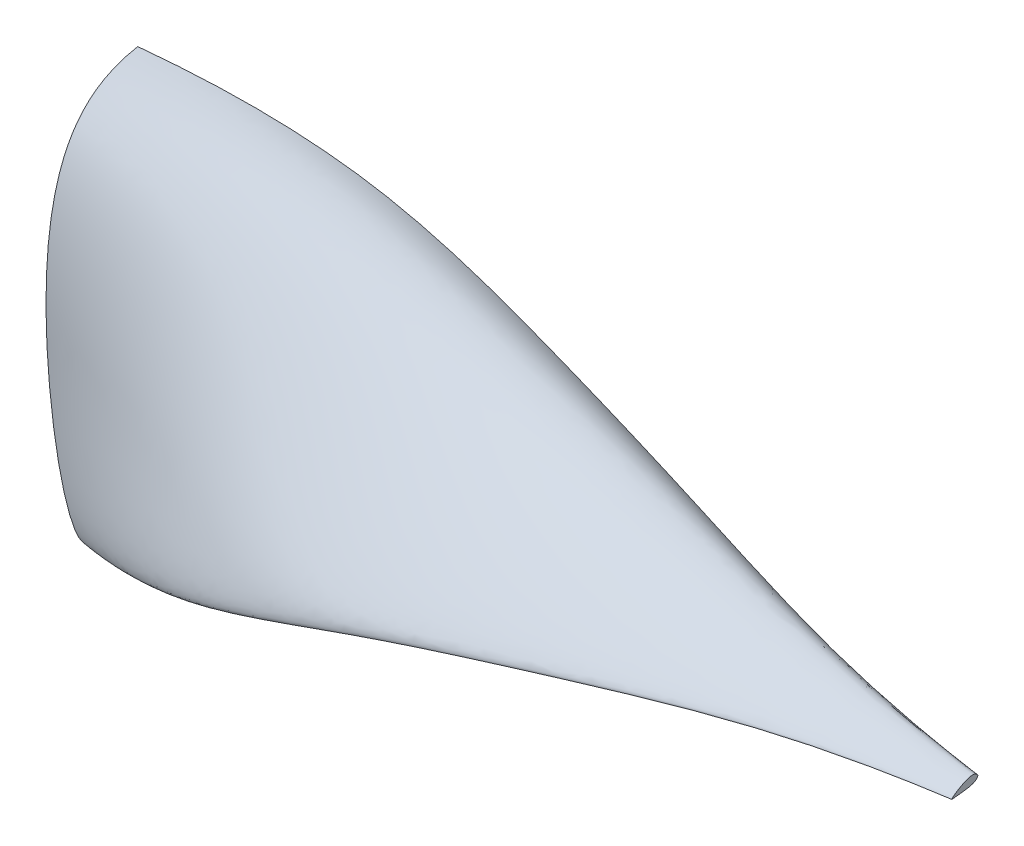
ISO-10303-21;
HEADER;
FILE_DESCRIPTION(('STEP AP214'),'2;1');
FILE_NAME('part.step','',(''),(''),'','','');
FILE_SCHEMA(('AUTOMOTIVE_DESIGN { 1 0 10303 214 1 1 1 1 }'));
ENDSEC;
DATA;
#1=APPLICATION_CONTEXT('core data for automotive mechanical design processes');
#2=APPLICATION_PROTOCOL_DEFINITION('international standard','automotive_design',2000,#1);
#3=PRODUCT_CONTEXT('',#1,'mechanical');
#4=PRODUCT('Part','Part','',(#3));
#5=PRODUCT_RELATED_PRODUCT_CATEGORY('part','',(#4));
#6=PRODUCT_DEFINITION_FORMATION('','',#4);
#7=PRODUCT_DEFINITION_CONTEXT('part definition',#1,'design');
#8=PRODUCT_DEFINITION('design','',#6,#7);
#9=PRODUCT_DEFINITION_SHAPE('','',#8);
#10=(LENGTH_UNIT() NAMED_UNIT(*) SI_UNIT(.MILLI.,.METRE.));
#11=(NAMED_UNIT(*) PLANE_ANGLE_UNIT() SI_UNIT($,.RADIAN.));
#12=(NAMED_UNIT(*) SI_UNIT($,.STERADIAN.) SOLID_ANGLE_UNIT());
#13=UNCERTAINTY_MEASURE_WITH_UNIT(LENGTH_MEASURE(1.E-05),#10,'distance_accuracy_value','');
#14=(GEOMETRIC_REPRESENTATION_CONTEXT(3) GLOBAL_UNCERTAINTY_ASSIGNED_CONTEXT((#13)) GLOBAL_UNIT_ASSIGNED_CONTEXT((#10,
#11,#12)) REPRESENTATION_CONTEXT('',''));
#15=CARTESIAN_POINT('',(0.,0.,0.));
#16=DIRECTION('',(0.,0.,1.));
#17=DIRECTION('',(1.,0.,0.));
#18=AXIS2_PLACEMENT_3D('',#15,#16,#17);
#19=CARTESIAN_POINT('',(250.,1.30686548325829,0.273489656084105));
#20=DIRECTION('',(-1.,0.,0.));
#21=DIRECTION('',(0.,0.,1.));
#22=AXIS2_PLACEMENT_3D('',#19,#20,#21);
#23=PLANE('',#22);
#24=CARTESIAN_POINT('',(250.,1.16948681889095,-3.82521902385213));
#25=CARTESIAN_POINT('',(250.,3.10858384582785,-2.51728156419939));
#26=CARTESIAN_POINT('',(250.,1.72673747669236,-0.151069954095973));
#27=CARTESIAN_POINT('',(250.,-0.471228127833241,3.83784511967977));
#28=CARTESIAN_POINT('',(250.,-1.16948681889095,3.82521902385213));
#29=B_SPLINE_CURVE_WITH_KNOTS('',4,(#24,#25,#26,#27,#28),.UNSPECIFIED.,.F.,.F.,(5,5),(0.,1.),.UNSPECIFIED.);
#30=CARTESIAN_POINT('',(250.,1.16948681889095,-3.82521902385213));
#31=VERTEX_POINT('',#30);
#32=CARTESIAN_POINT('',(250.,-1.16948681889095,3.82521902385213));
#33=VERTEX_POINT('',#32);
#34=EDGE_CURVE('E86',#31,#33,#29,.T.);
#35=ORIENTED_EDGE('',*,*,#34,.T.);
#36=CARTESIAN_POINT('',(250.,1.16948681889095,-3.82521902385213));
#37=CARTESIAN_POINT('',(250.,-0.296329525342011,-3.38706197351193));
#38=CARTESIAN_POINT('',(250.,-0.638437600874557,-1.75409289213371));
#39=CARTESIAN_POINT('',(250.,-1.16948681889095,3.82521902385213));
#40=B_SPLINE_CURVE_WITH_KNOTS('',3,(#36,#37,#38,#39),.UNSPECIFIED.,.F.,.F.,(4,4),(0.,1.),.UNSPECIFIED.);
#41=EDGE_CURVE('E12',#31,#33,#40,.T.);
#42=ORIENTED_EDGE('',*,*,#41,.F.);
#43=EDGE_LOOP('',(#35,#42));
#44=FACE_BOUND('',#43,.T.);
#45=ADVANCED_FACE('F76',(#44),#23,.F.);
#46=CARTESIAN_POINT('',(0.,4.22557269876326,19.5767893591818));
#47=DIRECTION('',(-1.,0.,0.));
#48=DIRECTION('',(0.,0.,1.));
#49=AXIS2_PLACEMENT_3D('',#46,#47,#48);
#50=PLANE('',#49);
#51=CARTESIAN_POINT('',(0.,59.5527690984794,-7.31216060430821));
#52=CARTESIAN_POINT('',(0.,53.4603914513021,27.2394299843727));
#53=CARTESIAN_POINT('',(0.,12.6050501264048,22.7401123856243));
#54=CARTESIAN_POINT('',(0.,-55.4656758458563,16.9575588739181));
#55=CARTESIAN_POINT('',(0.,-59.5527690984794,7.31216060430822));
#56=B_SPLINE_CURVE_WITH_KNOTS('',4,(#51,#52,#53,#54,#55),.UNSPECIFIED.,.F.,.F.,(5,5),(0.,1.),.UNSPECIFIED.);
#57=CARTESIAN_POINT('',(0.,59.5527690984794,-7.31216060430821));
#58=VERTEX_POINT('',#57);
#59=CARTESIAN_POINT('',(0.,-59.5527690984794,7.31216060430822));
#60=VERTEX_POINT('',#59);
#61=EDGE_CURVE('E110',#58,#60,#56,.T.);
#62=ORIENTED_EDGE('',*,*,#61,.F.);
#63=CARTESIAN_POINT('',(0.,59.5527690984794,-7.31216060430821));
#64=CARTESIAN_POINT('',(0.,44.6056050641096,-24.7252906325624));
#65=CARTESIAN_POINT('',(0.,20.1415144094825,-19.4504343728516));
#66=CARTESIAN_POINT('',(0.,-59.5527690984794,7.31216060430822));
#67=B_SPLINE_CURVE_WITH_KNOTS('',3,(#63,#64,#65,#66),.UNSPECIFIED.,.F.,.F.,(4,4),(0.,1.),.UNSPECIFIED.);
#68=EDGE_CURVE('E114',#58,#60,#67,.T.);
#69=ORIENTED_EDGE('',*,*,#68,.T.);
#70=EDGE_LOOP('',(#62,#69));
#71=FACE_BOUND('',#70,.T.);
#72=ADVANCED_FACE('F123',(#71),#50,.T.);
#73=CARTESIAN_POINT('',(0.,59.5527690984794,-7.31216060430821));
#74=CARTESIAN_POINT('',(16.1789264003987,53.343146355716,-15.8295456247036));
#75=CARTESIAN_POINT('',(49.1567457309767,41.3957101597492,-28.12955610495));
#76=CARTESIAN_POINT('',(99.528264501492,20.9488888121005,-29.6962479011514));
#77=CARTESIAN_POINT('',(149.977428698913,10.7513065505303,-21.7824127798203));
#78=CARTESIAN_POINT('',(199.755887440571,3.79217155618803,-10.4682463642104));
#79=CARTESIAN_POINT('',(233.199714112159,1.65235961481708,-5.84736336120564));
#80=CARTESIAN_POINT('',(250.,1.16948681889095,-3.82521902385213));
#81=CARTESIAN_POINT('',(0.,58.5373728239499,-1.5535621728614));
#82=CARTESIAN_POINT('',(16.20404995026,53.2362977335881,-10.2564344214272));
#83=CARTESIAN_POINT('',(49.1455806129104,42.865348874536,-23.5372577108526));
#84=CARTESIAN_POINT('',(99.5309045460377,23.1135153128776,-26.8807110127281));
#85=CARTESIAN_POINT('',(149.9776385338,12.4730104680861,-20.1626631829138));
#86=CARTESIAN_POINT('',(199.752455136307,4.67390243180021,-9.82161980667011));
#87=CARTESIAN_POINT('',(233.207505149668,2.11888293723436,-5.51311485073131));
#88=CARTESIAN_POINT('',(250.,1.49266965671377,-3.60722944724334));
#89=CARTESIAN_POINT('',(0.,54.3202799020746,7.52951986860422));
#90=CARTESIAN_POINT('',(16.2542970499826,50.8363001165161,-1.54432683630232));
#91=CARTESIAN_POINT('',(49.1232503767779,43.1715897470715,-15.0799596892537));
#92=CARTESIAN_POINT('',(99.5361846351285,25.4803820165101,-21.327949769435));
#93=CARTESIAN_POINT('',(149.978058203576,14.6096327609359,-16.6851834462028));
#94=CARTESIAN_POINT('',(199.745590527778,5.80373733479307,-8.34972036672962));
#95=CARTESIAN_POINT('',(233.223087224687,2.84449366539499,-4.77444661077891));
#96=CARTESIAN_POINT('',(250.,1.93159941568549,-3.10107907502201));
#97=CARTESIAN_POINT('',(0.,42.0346047411145,15.5039531792302));
#98=CARTESIAN_POINT('',(16.3836625499468,40.7760986070192,7.6904648186633));
#99=CARTESIAN_POINT('',(49.0657305234053,37.118753180627,-4.50776871445786));
#100=CARTESIAN_POINT('',(99.5498747585872,24.0531292472325,-12.553564803054));
#101=CARTESIAN_POINT('',(149.97878889684,14.586179162887,-10.7967833242917));
#102=CARTESIAN_POINT('',(199.729213350782,6.10087219117595,-5.65971687909512));
#103=CARTESIAN_POINT('',(233.26043851757,3.08408345000557,-3.31216297537729));
#104=CARTESIAN_POINT('',(250.,2.0839925264278,-2.14114399702675));
#105=CARTESIAN_POINT('',(0.,24.8779042888092,19.2439416006856));
#106=CARTESIAN_POINT('',(16.5317625265713,25.6820096467217,13.6975378541872));
#107=CARTESIAN_POINT('',(48.9998482658906,25.8048685577204,4.83243434767723));
#108=CARTESIAN_POINT('',(99.5656560873901,18.7553943410906,-3.35026231383816));
#109=CARTESIAN_POINT('',(149.979229939957,12.0340240702728,-4.11690398653694));
#110=CARTESIAN_POINT('',(199.711930127395,5.27865766936311,-2.49640150021967));
#111=CARTESIAN_POINT('',(233.300071571322,2.76298772994455,-1.56071707423396));
#112=CARTESIAN_POINT('',(250.,1.84669033176127,-0.990303536716224));
#113=CARTESIAN_POINT('',(0.,4.42933417846765,19.928820145064));
#114=CARTESIAN_POINT('',(16.6253364726228,7.13342988339662,17.4861403546685));
#115=CARTESIAN_POINT('',(48.9582025014524,10.8738310694341,13.1227998408345));
#116=CARTESIAN_POINT('',(99.5756920902288,10.746449791867,6.11774198994323));
#117=CARTESIAN_POINT('',(149.979272355235,7.73026647125464,2.91460664960699));
#118=CARTESIAN_POINT('',(199.70188565128,3.67330186023743,0.939217189111293));
#119=CARTESIAN_POINT('',(233.323244635911,2.02640225001506,0.361966212003716));
#120=CARTESIAN_POINT('',(250.,1.3337842335413,0.269114645751064));
#121=CARTESIAN_POINT('',(0.,-17.2418048101001,18.5015139741491));
#122=CARTESIAN_POINT('',(16.5895889545524,-12.8488610279682,19.5629743330088));
#123=CARTESIAN_POINT('',(48.9741126459712,-5.77454708870133,20.3044514359493));
#124=CARTESIAN_POINT('',(99.5718565823615,1.29717102175357,15.2562116520226));
#125=CARTESIAN_POINT('',(149.979261653452,2.4258649798384,9.9716570689477));
#126=CARTESIAN_POINT('',(199.705702494044,1.61513724853688,4.41694057720899));
#127=CARTESIAN_POINT('',(233.31443547217,1.05014880820358,2.3311678914672));
#128=CARTESIAN_POINT('',(250.,0.659365633623259,1.5547828902166));
#129=CARTESIAN_POINT('',(0.,-37.5760667505785,15.668538399416));
#130=CARTESIAN_POINT('',(16.4362941551827,-31.8963415202149,20.101207119963));
#131=CARTESIAN_POINT('',(49.0423260110756,-21.9335232264534,25.9481910719846));
#132=CARTESIAN_POINT('',(99.5554541796507,-8.25123307008734,23.2398470802758));
#133=CARTESIAN_POINT('',(149.979050957503,-3.0407217496028,16.1836528179859));
#134=CARTESIAN_POINT('',(199.722680913335,-0.565514847750493,7.53801944997601));
#135=CARTESIAN_POINT('',(233.275356171381,-0.00562100497302513,4.10526203922798));
#136=CARTESIAN_POINT('',(250.,-0.0646888865885243,2.71185001371136));
#137=CARTESIAN_POINT('',(0.,-53.5238605701488,11.8999988820305));
#138=CARTESIAN_POINT('',(16.2453885303494,-47.0486258072283,19.1930714943257));
#139=CARTESIAN_POINT('',(49.1272099569429,-35.208218987033,29.1955544705311));
#140=CARTESIAN_POINT('',(99.5352466376473,-16.4271072887507,28.8605473228474));
#141=CARTESIAN_POINT('',(149.977990600254,-7.86695124267216,20.7866632967324));
#142=CARTESIAN_POINT('',(199.746782374919,-2.52387828096364,9.85625205301036));
#143=CARTESIAN_POINT('',(233.220378401349,-0.990710841355025,5.48263871495322));
#144=CARTESIAN_POINT('',(250.,-0.726502745689739,3.58546483326633));
#145=CARTESIAN_POINT('',(0.,-58.8715868897089,8.91972698257654));
#146=CARTESIAN_POINT('',(16.2010804437156,-52.5734268068931,17.0290078669385));
#147=CARTESIAN_POINT('',(49.1469004729655,-40.2325251042001,29.1365402173131));
#148=CARTESIAN_POINT('',(99.5305918802103,-19.9624532768265,30.0267603384985));
#149=CARTESIAN_POINT('',(149.97761599936,-10.0512004608494,21.9090696818906));
#150=CARTESIAN_POINT('',(199.752852418687,-3.47566296385535,10.5073795785554));
#151=CARTESIAN_POINT('',(233.206602208556,-1.46309493288718,5.80781089195471));
#152=CARTESIAN_POINT('',(250.,-1.05311037038133,3.82732337315674));
#153=CARTESIAN_POINT('',(0.,-59.5527690984794,7.31216060430822));
#154=CARTESIAN_POINT('',(16.1789264003987,-53.3431463557161,15.8295456247036));
#155=CARTESIAN_POINT('',(49.1567457309767,-41.3957101597492,28.1295561049501));
#156=CARTESIAN_POINT('',(99.528264501492,-20.9488888121005,29.6962479011514));
#157=CARTESIAN_POINT('',(149.977428698913,-10.7513065505303,21.7824127798204));
#158=CARTESIAN_POINT('',(199.755887440571,-3.79217155618803,10.4682463642104));
#159=CARTESIAN_POINT('',(233.199714112159,-1.65235961481708,5.84736336120564));
#160=CARTESIAN_POINT('',(250.,-1.16948681889095,3.82521902385213));
#161=B_SPLINE_SURFACE_WITH_KNOTS('',3,3,((#73,#74,#75,#76,#77,#78,#79,#80),(#81,#82,#83,#84,#85,
#86,#87,#88),(#89,#90,#91,#92,#93,#94,#95,#96),(#97,#98,#99,#100,#101,#102,#103,#104),(#105,
#106,#107,#108,#109,#110,#111,#112),(#113,#114,#115,#116,#117,#118,#119,#120),(#121,#122,#123,
#124,#125,#126,#127,#128),(#129,#130,#131,#132,#133,#134,#135,#136),(#137,#138,#139,#140,#141,
#142,#143,#144),(#145,#146,#147,#148,#149,#150,#151,#152),(#153,#154,#155,#156,#157,#158,#159,
#160)),.UNSPECIFIED.,.F.,.F.,.F.,(4,1,1,1,1,1,1,1,4),(4,1,1,1,1,4),(0.,0.125,0.25,0.375,0.5,
0.625,0.75,0.875,1.),(0.,0.208562646002727,0.409868836144693,0.607590643143211,
0.804728430129806,1.),.UNSPECIFIED.);
#162=CARTESIAN_POINT('',(0.,-59.5527690984794,7.31216060430822));
#163=CARTESIAN_POINT('',(16.1789264003987,-53.3431463557161,15.8295456247036));
#164=CARTESIAN_POINT('',(49.1567457309767,-41.3957101597492,28.1295561049501));
#165=CARTESIAN_POINT('',(99.528264501492,-20.9488888121005,29.6962479011514));
#166=CARTESIAN_POINT('',(149.977428698913,-10.7513065505303,21.7824127798204));
#167=CARTESIAN_POINT('',(199.755887440571,-3.79217155618803,10.4682463642104));
#168=CARTESIAN_POINT('',(233.199714112159,-1.65235961481708,5.84736336120564));
#169=CARTESIAN_POINT('',(250.,-1.16948681889095,3.82521902385213));
#170=B_SPLINE_CURVE_WITH_KNOTS('',3,(#162,#163,#164,#165,#166,#167,#168,#169),.UNSPECIFIED.,.F.,
.F.,(4,1,1,1,1,4),(0.,0.208562646002727,0.409868836144693,0.607590643143211,0.804728430129806,
1.),.UNSPECIFIED.);
#171=EDGE_CURVE('E94',#60,#33,#170,.T.);
#172=CARTESIAN_POINT('',(0.,59.5527690984794,-7.31216060430821));
#173=CARTESIAN_POINT('',(16.1789264003987,53.343146355716,-15.8295456247036));
#174=CARTESIAN_POINT('',(49.1567457309767,41.3957101597492,-28.12955610495));
#175=CARTESIAN_POINT('',(99.528264501492,20.9488888121005,-29.6962479011514));
#176=CARTESIAN_POINT('',(149.977428698913,10.7513065505303,-21.7824127798203));
#177=CARTESIAN_POINT('',(199.755887440571,3.79217155618803,-10.4682463642104));
#178=CARTESIAN_POINT('',(233.199714112159,1.65235961481708,-5.84736336120564));
#179=CARTESIAN_POINT('',(250.,1.16948681889095,-3.82521902385213));
#180=B_SPLINE_CURVE_WITH_KNOTS('',3,(#172,#173,#174,#175,#176,#177,#178,#179),.UNSPECIFIED.,.F.,
.F.,(4,1,1,1,1,4),(0.,0.208562646002727,0.409868836144693,0.607590643143211,0.804728430129806,
1.),.UNSPECIFIED.);
#181=EDGE_CURVE('E106',#31,#58,#180,.F.);
#182=ORIENTED_EDGE('',*,*,#61,.T.);
#183=ORIENTED_EDGE('',*,*,#171,.T.);
#184=ORIENTED_EDGE('',*,*,#34,.F.);
#185=ORIENTED_EDGE('',*,*,#181,.T.);
#186=EDGE_LOOP('',(#182,#183,#184,#185));
#187=FACE_BOUND('',#186,.T.);
#188=ADVANCED_FACE('F108',(#187),#161,.T.);
#189=CARTESIAN_POINT('',(0.,-59.5527690984794,7.31216060430822));
#190=CARTESIAN_POINT('',(16.1789264003987,-53.343146355716,15.8295456247036));
#191=CARTESIAN_POINT('',(49.1567457309767,-41.3957101597492,28.1295561049501));
#192=CARTESIAN_POINT('',(99.528264501492,-20.9488888121005,29.6962479011514));
#193=CARTESIAN_POINT('',(149.977428698913,-10.7513065505303,21.7824127798204));
#194=CARTESIAN_POINT('',(199.755887440571,-3.79217155618803,10.4682463642104));
#195=CARTESIAN_POINT('',(233.199714112159,-1.65235961481708,5.84736336120564));
#196=CARTESIAN_POINT('',(250.,-1.16948681889095,3.82521902385213));
#197=CARTESIAN_POINT('',(0.,20.1415144094825,-19.4504343728516));
#198=CARTESIAN_POINT('',(16.1789264003987,22.2113886570703,-16.6113060327198));
#199=CARTESIAN_POINT('',(49.1567457309767,4.49704070579105,-24.0046003231024));
#200=CARTESIAN_POINT('',(99.528264501492,0.244647814065726,-16.5107761151783));
#201=CARTESIAN_POINT('',(149.977428698913,-2.29097668441911,-11.0717858497155));
#202=CARTESIAN_POINT('',(199.755887440571,-1.57395623251832,-5.66193341043592));
#203=CARTESIAN_POINT('',(233.199714112159,-0.799395199516602,-1.08004477968255));
#204=CARTESIAN_POINT('',(250.,-0.638437600874557,-1.75409289213371));
#205=CARTESIAN_POINT('',(0.,44.6056050641096,-24.7252906325624));
#206=CARTESIAN_POINT('',(16.1789264003987,42.5357308165218,-27.5644189726942));
#207=CARTESIAN_POINT('',(49.1567457309767,21.1936430292631,-36.1877818410786));
#208=CARTESIAN_POINT('',(99.528264501492,7.68083572262252,-29.8918488336406));
#209=CARTESIAN_POINT('',(149.977428698913,1.4201102621357,-20.5130307469668));
#210=CARTESIAN_POINT('',(199.755887440571,-0.495203093889803,-9.94408844278436));
#211=CARTESIAN_POINT('',(233.199714112159,-0.135371926699968,-4.0611100859631));
#212=CARTESIAN_POINT('',(250.,-0.296329525342011,-3.38706197351193));
#213=CARTESIAN_POINT('',(0.,59.5527690984794,-7.31216060430821));
#214=CARTESIAN_POINT('',(16.1789264003987,53.343146355716,-15.8295456247036));
#215=CARTESIAN_POINT('',(49.1567457309767,41.3957101597492,-28.12955610495));
#216=CARTESIAN_POINT('',(99.528264501492,20.9488888121005,-29.6962479011514));
#217=CARTESIAN_POINT('',(149.977428698913,10.7513065505303,-21.7824127798203));
#218=CARTESIAN_POINT('',(199.755887440571,3.79217155618803,-10.4682463642104));
#219=CARTESIAN_POINT('',(233.199714112159,1.65235961481708,-5.84736336120564));
#220=CARTESIAN_POINT('',(250.,1.16948681889095,-3.82521902385213));
#221=B_SPLINE_SURFACE_WITH_KNOTS('',3,3,((#189,#190,#191,#192,#193,#194,#195,#196),(#197,#198,
#199,#200,#201,#202,#203,#204),(#205,#206,#207,#208,#209,#210,#211,#212),(#213,#214,#215,#216,
#217,#218,#219,#220)),.UNSPECIFIED.,.F.,.F.,.F.,(4,4),(4,1,1,1,1,4),(0.,1.),(0.,
0.208562646002727,0.409868836144693,0.607590643143211,0.804728430129806,1.),.UNSPECIFIED.);
#222=ORIENTED_EDGE('',*,*,#68,.F.);
#223=ORIENTED_EDGE('',*,*,#181,.F.);
#224=ORIENTED_EDGE('',*,*,#41,.T.);
#225=ORIENTED_EDGE('',*,*,#171,.F.);
#226=EDGE_LOOP('',(#222,#223,#224,#225));
#227=FACE_BOUND('',#226,.T.);
#228=ADVANCED_FACE('F117',(#227),#221,.T.);
#229=CLOSED_SHELL('',(#45,#72,#188,#228));
#230=MANIFOLD_SOLID_BREP('B2',#229);
#231=ADVANCED_BREP_SHAPE_REPRESENTATION('',(#18,#230),#14);
#232=SHAPE_DEFINITION_REPRESENTATION(#9,#231);
ENDSEC;
END-ISO-10303-21;
